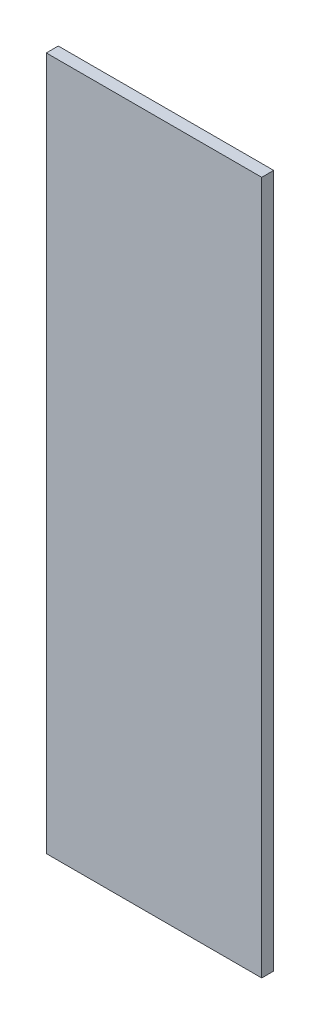
ISO-10303-21;
HEADER;
FILE_DESCRIPTION(('STEP AP214'),'2;1');
FILE_NAME('part.step','',(''),(''),'','','');
FILE_SCHEMA(('AUTOMOTIVE_DESIGN { 1 0 10303 214 1 1 1 1 }'));
ENDSEC;
DATA;
#1=APPLICATION_CONTEXT('core data for automotive mechanical design processes');
#2=APPLICATION_PROTOCOL_DEFINITION('international standard','automotive_design',2000,#1);
#3=PRODUCT_CONTEXT('',#1,'mechanical');
#4=PRODUCT('Part','Part','',(#3));
#5=PRODUCT_RELATED_PRODUCT_CATEGORY('part','',(#4));
#6=PRODUCT_DEFINITION_FORMATION('','',#4);
#7=PRODUCT_DEFINITION_CONTEXT('part definition',#1,'design');
#8=PRODUCT_DEFINITION('design','',#6,#7);
#9=PRODUCT_DEFINITION_SHAPE('','',#8);
#10=(LENGTH_UNIT() NAMED_UNIT(*) SI_UNIT(.MILLI.,.METRE.));
#11=(NAMED_UNIT(*) PLANE_ANGLE_UNIT() SI_UNIT($,.RADIAN.));
#12=(NAMED_UNIT(*) SI_UNIT($,.STERADIAN.) SOLID_ANGLE_UNIT());
#13=UNCERTAINTY_MEASURE_WITH_UNIT(LENGTH_MEASURE(1.E-05),#10,'distance_accuracy_value','');
#14=(GEOMETRIC_REPRESENTATION_CONTEXT(3) GLOBAL_UNCERTAINTY_ASSIGNED_CONTEXT((#13)) GLOBAL_UNIT_ASSIGNED_CONTEXT((#10,
#11,#12)) REPRESENTATION_CONTEXT('',''));
#15=CARTESIAN_POINT('',(0.,0.,0.));
#16=DIRECTION('',(0.,0.,1.));
#17=DIRECTION('',(1.,0.,0.));
#18=AXIS2_PLACEMENT_3D('',#15,#16,#17);
#19=CARTESIAN_POINT('',(-57.15,183.9595,6.35));
#20=DIRECTION('',(0.,1.,0.));
#21=DIRECTION('',(0.,0.,1.));
#22=AXIS2_PLACEMENT_3D('',#19,#20,#21);
#23=PLANE('',#22);
#24=DIRECTION('',(1.,0.,0.));
#25=VECTOR('',#24,1.);
#26=CARTESIAN_POINT('',(-57.15,183.9595,0.));
#27=LINE('',#26,#25);
#28=CARTESIAN_POINT('',(-57.15,183.9595,0.));
#29=VERTEX_POINT('',#28);
#30=CARTESIAN_POINT('',(57.15,183.9595,0.));
#31=VERTEX_POINT('',#30);
#32=EDGE_CURVE('E98',#29,#31,#27,.T.);
#33=ORIENTED_EDGE('',*,*,#32,.F.);
#34=DIRECTION('',(0.,0.,-1.));
#35=VECTOR('',#34,1.);
#36=CARTESIAN_POINT('',(-57.15,183.9595,6.35));
#37=LINE('',#36,#35);
#38=CARTESIAN_POINT('',(-57.15,183.9595,6.35));
#39=VERTEX_POINT('',#38);
#40=EDGE_CURVE('E11',#39,#29,#37,.T.);
#41=ORIENTED_EDGE('',*,*,#40,.F.);
#42=DIRECTION('',(1.,0.,0.));
#43=VECTOR('',#42,1.);
#44=CARTESIAN_POINT('',(-57.15,183.9595,6.35));
#45=LINE('',#44,#43);
#46=CARTESIAN_POINT('',(57.15,183.9595,6.35));
#47=VERTEX_POINT('',#46);
#48=EDGE_CURVE('E93',#39,#47,#45,.T.);
#49=ORIENTED_EDGE('',*,*,#48,.T.);
#50=DIRECTION('',(0.,0.,-1.));
#51=VECTOR('',#50,1.);
#52=CARTESIAN_POINT('',(57.15,183.9595,6.35));
#53=LINE('',#52,#51);
#54=EDGE_CURVE('E36',#47,#31,#53,.T.);
#55=ORIENTED_EDGE('',*,*,#54,.T.);
#56=EDGE_LOOP('',(#33,#41,#49,#55));
#57=FACE_BOUND('',#56,.T.);
#58=ADVANCED_FACE('F33',(#57),#23,.T.);
#59=CARTESIAN_POINT('',(-57.15,183.9595,6.35));
#60=DIRECTION('',(1.,0.,0.));
#61=DIRECTION('',(0.,1.,0.));
#62=AXIS2_PLACEMENT_3D('',#59,#60,#61);
#63=PLANE('',#62);
#64=DIRECTION('',(0.,-1.,0.));
#65=VECTOR('',#64,1.);
#66=CARTESIAN_POINT('',(-57.15,183.9595,0.));
#67=LINE('',#66,#65);
#68=CARTESIAN_POINT('',(-57.15,-183.9595,0.));
#69=VERTEX_POINT('',#68);
#70=EDGE_CURVE('E66',#29,#69,#67,.T.);
#71=ORIENTED_EDGE('',*,*,#70,.T.);
#72=DIRECTION('',(0.,0.,-1.));
#73=VECTOR('',#72,1.);
#74=CARTESIAN_POINT('',(-57.15,-183.9595,6.35));
#75=LINE('',#74,#73);
#76=CARTESIAN_POINT('',(-57.15,-183.9595,6.35));
#77=VERTEX_POINT('',#76);
#78=EDGE_CURVE('E42',#77,#69,#75,.T.);
#79=ORIENTED_EDGE('',*,*,#78,.F.);
#80=DIRECTION('',(0.,-1.,0.));
#81=VECTOR('',#80,1.);
#82=CARTESIAN_POINT('',(-57.15,183.9595,6.35));
#83=LINE('',#82,#81);
#84=EDGE_CURVE('E83',#39,#77,#83,.T.);
#85=ORIENTED_EDGE('',*,*,#84,.F.);
#86=ORIENTED_EDGE('',*,*,#40,.T.);
#87=EDGE_LOOP('',(#71,#79,#85,#86));
#88=FACE_BOUND('',#87,.T.);
#89=ADVANCED_FACE('F108',(#88),#63,.F.);
#90=CARTESIAN_POINT('',(-57.15,-183.9595,6.35));
#91=DIRECTION('',(0.,1.,0.));
#92=DIRECTION('',(0.,0.,1.));
#93=AXIS2_PLACEMENT_3D('',#90,#91,#92);
#94=PLANE('',#93);
#95=DIRECTION('',(1.,0.,0.));
#96=VECTOR('',#95,1.);
#97=CARTESIAN_POINT('',(-57.15,-183.9595,0.));
#98=LINE('',#97,#96);
#99=CARTESIAN_POINT('',(57.15,-183.9595,0.));
#100=VERTEX_POINT('',#99);
#101=EDGE_CURVE('E90',#69,#100,#98,.T.);
#102=ORIENTED_EDGE('',*,*,#101,.T.);
#103=DIRECTION('',(0.,0.,-1.));
#104=VECTOR('',#103,1.);
#105=CARTESIAN_POINT('',(57.15,-183.9595,6.35));
#106=LINE('',#105,#104);
#107=CARTESIAN_POINT('',(57.15,-183.9595,6.35));
#108=VERTEX_POINT('',#107);
#109=EDGE_CURVE('E87',#108,#100,#106,.T.);
#110=ORIENTED_EDGE('',*,*,#109,.F.);
#111=DIRECTION('',(1.,0.,0.));
#112=VECTOR('',#111,1.);
#113=CARTESIAN_POINT('',(-57.15,-183.9595,6.35));
#114=LINE('',#113,#112);
#115=EDGE_CURVE('E78',#77,#108,#114,.T.);
#116=ORIENTED_EDGE('',*,*,#115,.F.);
#117=ORIENTED_EDGE('',*,*,#78,.T.);
#118=EDGE_LOOP('',(#102,#110,#116,#117));
#119=FACE_BOUND('',#118,.T.);
#120=ADVANCED_FACE('F88',(#119),#94,.F.);
#121=CARTESIAN_POINT('',(57.15,183.9595,6.35));
#122=DIRECTION('',(1.,0.,0.));
#123=DIRECTION('',(0.,1.,0.));
#124=AXIS2_PLACEMENT_3D('',#121,#122,#123);
#125=PLANE('',#124);
#126=DIRECTION('',(0.,-1.,0.));
#127=VECTOR('',#126,1.);
#128=CARTESIAN_POINT('',(57.15,183.9595,0.));
#129=LINE('',#128,#127);
#130=EDGE_CURVE('E101',#31,#100,#129,.T.);
#131=ORIENTED_EDGE('',*,*,#130,.F.);
#132=ORIENTED_EDGE('',*,*,#54,.F.);
#133=DIRECTION('',(0.,-1.,0.));
#134=VECTOR('',#133,1.);
#135=CARTESIAN_POINT('',(57.15,183.9595,6.35));
#136=LINE('',#135,#134);
#137=EDGE_CURVE('E82',#47,#108,#136,.T.);
#138=ORIENTED_EDGE('',*,*,#137,.T.);
#139=ORIENTED_EDGE('',*,*,#109,.T.);
#140=EDGE_LOOP('',(#131,#132,#138,#139));
#141=FACE_BOUND('',#140,.T.);
#142=ADVANCED_FACE('F92',(#141),#125,.T.);
#143=CARTESIAN_POINT('',(0.,0.,6.35));
#144=DIRECTION('',(0.,0.,-1.));
#145=DIRECTION('',(-1.,0.,0.));
#146=AXIS2_PLACEMENT_3D('',#143,#144,#145);
#147=PLANE('',#146);
#148=ORIENTED_EDGE('',*,*,#48,.F.);
#149=ORIENTED_EDGE('',*,*,#84,.T.);
#150=ORIENTED_EDGE('',*,*,#115,.T.);
#151=ORIENTED_EDGE('',*,*,#137,.F.);
#152=EDGE_LOOP('',(#148,#149,#150,#151));
#153=FACE_BOUND('',#152,.T.);
#154=ADVANCED_FACE('F81',(#153),#147,.F.);
#155=CARTESIAN_POINT('',(0.,0.,0.));
#156=DIRECTION('',(0.,0.,-1.));
#157=DIRECTION('',(-1.,0.,0.));
#158=AXIS2_PLACEMENT_3D('',#155,#156,#157);
#159=PLANE('',#158);
#160=ORIENTED_EDGE('',*,*,#32,.T.);
#161=ORIENTED_EDGE('',*,*,#130,.T.);
#162=ORIENTED_EDGE('',*,*,#101,.F.);
#163=ORIENTED_EDGE('',*,*,#70,.F.);
#164=EDGE_LOOP('',(#160,#161,#162,#163));
#165=FACE_BOUND('',#164,.T.);
#166=ADVANCED_FACE('F106',(#165),#159,.T.);
#167=CLOSED_SHELL('',(#58,#89,#120,#142,#154,#166));
#168=MANIFOLD_SOLID_BREP('B2',#167);
#169=ADVANCED_BREP_SHAPE_REPRESENTATION('',(#18,#168),#14);
#170=SHAPE_DEFINITION_REPRESENTATION(#9,#169);
ENDSEC;
END-ISO-10303-21;
